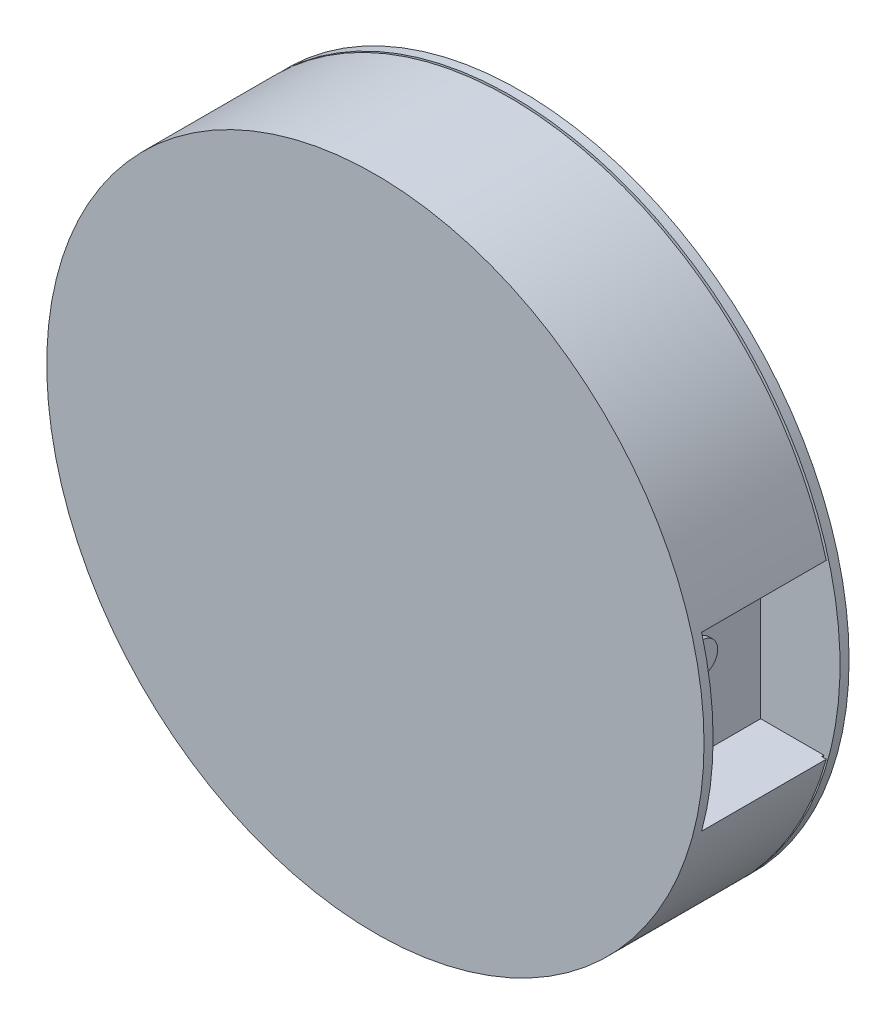
ISO-10303-21;
HEADER;
FILE_DESCRIPTION(('STEP AP214'),'2;1');
FILE_NAME('part.step','',(''),(''),'','','');
FILE_SCHEMA(('AUTOMOTIVE_DESIGN { 1 0 10303 214 1 1 1 1 }'));
ENDSEC;
DATA;
#1=APPLICATION_CONTEXT('core data for automotive mechanical design processes');
#2=APPLICATION_PROTOCOL_DEFINITION('international standard','automotive_design',2000,#1);
#3=PRODUCT_CONTEXT('',#1,'mechanical');
#4=PRODUCT('Part','Part','',(#3));
#5=PRODUCT_RELATED_PRODUCT_CATEGORY('part','',(#4));
#6=PRODUCT_DEFINITION_FORMATION('','',#4);
#7=PRODUCT_DEFINITION_CONTEXT('part definition',#1,'design');
#8=PRODUCT_DEFINITION('design','',#6,#7);
#9=PRODUCT_DEFINITION_SHAPE('','',#8);
#10=(LENGTH_UNIT() NAMED_UNIT(*) SI_UNIT(.MILLI.,.METRE.));
#11=(NAMED_UNIT(*) PLANE_ANGLE_UNIT() SI_UNIT($,.RADIAN.));
#12=(NAMED_UNIT(*) SI_UNIT($,.STERADIAN.) SOLID_ANGLE_UNIT());
#13=UNCERTAINTY_MEASURE_WITH_UNIT(LENGTH_MEASURE(1.E-05),#10,'distance_accuracy_value','');
#14=(GEOMETRIC_REPRESENTATION_CONTEXT(3) GLOBAL_UNCERTAINTY_ASSIGNED_CONTEXT((#13)) GLOBAL_UNIT_ASSIGNED_CONTEXT((#10,
#11,#12)) REPRESENTATION_CONTEXT('',''));
#15=CARTESIAN_POINT('',(0.,0.,0.));
#16=DIRECTION('',(0.,0.,1.));
#17=DIRECTION('',(1.,0.,0.));
#18=AXIS2_PLACEMENT_3D('',#15,#16,#17);
#19=CARTESIAN_POINT('',(0.,0.,32.));
#20=DIRECTION('',(0.,0.,-1.));
#21=DIRECTION('',(-1.,0.,0.));
#22=AXIS2_PLACEMENT_3D('',#19,#20,#21);
#23=CYLINDRICAL_SURFACE('',#22,72.4999999999998);
#24=CARTESIAN_POINT('',(0.,0.,0.));
#25=DIRECTION('',(0.,0.,1.));
#26=DIRECTION('',(1.,0.,0.));
#27=AXIS2_PLACEMENT_3D('',#24,#25,#26);
#28=CIRCLE('',#27,72.4999999999998);
#29=CARTESIAN_POINT('',(72.4999999999998,0.,0.));
#30=VERTEX_POINT('',#29);
#31=EDGE_CURVE('E166',#30,#30,#28,.T.);
#32=ORIENTED_EDGE('',*,*,#31,.T.);
#33=EDGE_LOOP('',(#32));
#34=FACE_BOUND('',#33,.T.);
#35=CARTESIAN_POINT('',(0.,0.,2.));
#36=DIRECTION('',(0.,0.,-1.));
#37=DIRECTION('',(-1.,0.,0.));
#38=AXIS2_PLACEMENT_3D('',#35,#36,#37);
#39=CIRCLE('',#38,72.4999999999998);
#40=CARTESIAN_POINT('',(-72.4999999999998,0.,2.));
#41=VERTEX_POINT('',#40);
#42=EDGE_CURVE('E163',#41,#41,#39,.T.);
#43=ORIENTED_EDGE('',*,*,#42,.T.);
#44=EDGE_LOOP('',(#43));
#45=FACE_BOUND('',#44,.T.);
#46=ADVANCED_FACE('F33',(#34,#45),#23,.T.);
#47=CARTESIAN_POINT('',(0.,0.,0.));
#48=DIRECTION('',(0.,0.,1.));
#49=DIRECTION('',(1.,0.,0.));
#50=AXIS2_PLACEMENT_3D('',#47,#48,#49);
#51=PLANE('',#50);
#52=ORIENTED_EDGE('',*,*,#31,.F.);
#53=EDGE_LOOP('',(#52));
#54=FACE_BOUND('',#53,.T.);
#55=ADVANCED_FACE('F207',(#54),#51,.F.);
#56=CARTESIAN_POINT('',(72.4999999999998,0.,2.));
#57=DIRECTION('',(0.,0.,1.));
#58=DIRECTION('',(1.,0.,0.));
#59=AXIS2_PLACEMENT_3D('',#56,#57,#58);
#60=PLANE('',#59);
#61=ORIENTED_EDGE('',*,*,#42,.F.);
#62=EDGE_LOOP('',(#61));
#63=FACE_BOUND('',#62,.T.);
#64=DIRECTION('',(1.,0.,0.));
#65=VECTOR('',#64,1.);
#66=CARTESIAN_POINT('',(54.9999999999998,-19.,2.));
#67=LINE('',#66,#65);
#68=CARTESIAN_POINT('',(54.9999999999998,-19.,2.));
#69=VERTEX_POINT('',#68);
#70=CARTESIAN_POINT('',(68.929311617047,-19.,2.));
#71=VERTEX_POINT('',#70);
#72=EDGE_CURVE('E107',#69,#71,#67,.T.);
#73=ORIENTED_EDGE('',*,*,#72,.T.);
#74=CARTESIAN_POINT('',(0.,0.,2.));
#75=DIRECTION('',(0.,0.,-1.));
#76=DIRECTION('',(-1.,0.,0.));
#77=AXIS2_PLACEMENT_3D('',#74,#75,#76);
#78=CIRCLE('',#77,71.4999999999998);
#79=CARTESIAN_POINT('',(68.929311617047,19.,2.));
#80=VERTEX_POINT('',#79);
#81=EDGE_CURVE('E160',#71,#80,#78,.T.);
#82=ORIENTED_EDGE('',*,*,#81,.T.);
#83=DIRECTION('',(1.,0.,0.));
#84=VECTOR('',#83,1.);
#85=CARTESIAN_POINT('',(54.9999999999998,19.,2.));
#86=LINE('',#85,#84);
#87=CARTESIAN_POINT('',(54.9999999999998,19.,2.));
#88=VERTEX_POINT('',#87);
#89=EDGE_CURVE('E143',#88,#80,#86,.T.);
#90=ORIENTED_EDGE('',*,*,#89,.F.);
#91=DIRECTION('',(0.,1.,0.));
#92=VECTOR('',#91,1.);
#93=CARTESIAN_POINT('',(54.9999999999998,-19.,2.));
#94=LINE('',#93,#92);
#95=EDGE_CURVE('E134',#69,#88,#94,.T.);
#96=ORIENTED_EDGE('',*,*,#95,.F.);
#97=EDGE_LOOP('',(#73,#82,#90,#96));
#98=FACE_BOUND('',#97,.T.);
#99=ADVANCED_FACE('F187',(#63,#98),#60,.T.);
#100=CARTESIAN_POINT('',(0.,0.,0.));
#101=DIRECTION('',(0.,0.,-1.));
#102=DIRECTION('',(-1.,0.,0.));
#103=AXIS2_PLACEMENT_3D('',#100,#101,#102);
#104=CYLINDRICAL_SURFACE('',#103,71.4999999999998);
#105=DIRECTION('',(0.,0.,-1.));
#106=VECTOR('',#105,1.);
#107=CARTESIAN_POINT('',(68.929311617047,-19.,0.));
#108=LINE('',#107,#106);
#109=CARTESIAN_POINT('',(68.929311617047,-19.,2.5));
#110=VERTEX_POINT('',#109);
#111=EDGE_CURVE('E152',#110,#71,#108,.T.);
#112=ORIENTED_EDGE('',*,*,#111,.F.);
#113=CARTESIAN_POINT('',(0.,0.,2.5));
#114=DIRECTION('',(0.,0.,-1.));
#115=DIRECTION('',(-1.,0.,0.));
#116=AXIS2_PLACEMENT_3D('',#113,#114,#115);
#117=CIRCLE('',#116,71.4999999999998);
#118=CARTESIAN_POINT('',(68.929311617047,19.,2.5));
#119=VERTEX_POINT('',#118);
#120=EDGE_CURVE('E157',#110,#119,#117,.T.);
#121=ORIENTED_EDGE('',*,*,#120,.T.);
#122=DIRECTION('',(0.,0.,-1.));
#123=VECTOR('',#122,1.);
#124=CARTESIAN_POINT('',(68.929311617047,19.,0.));
#125=LINE('',#124,#123);
#126=EDGE_CURVE('E149',#80,#119,#125,.F.);
#127=ORIENTED_EDGE('',*,*,#126,.F.);
#128=ORIENTED_EDGE('',*,*,#81,.F.);
#129=EDGE_LOOP('',(#112,#121,#127,#128));
#130=FACE_BOUND('',#129,.T.);
#131=ADVANCED_FACE('F182',(#130),#104,.T.);
#132=CARTESIAN_POINT('',(72.4999999999998,0.,2.5));
#133=DIRECTION('',(0.,0.,-1.));
#134=DIRECTION('',(-1.,0.,0.));
#135=AXIS2_PLACEMENT_3D('',#132,#133,#134);
#136=PLANE('',#135);
#137=DIRECTION('',(-1.,0.,0.));
#138=VECTOR('',#137,1.);
#139=CARTESIAN_POINT('',(72.4999999999998,-19.,2.5));
#140=LINE('',#139,#138);
#141=CARTESIAN_POINT('',(69.966063202098,-19.,2.5));
#142=VERTEX_POINT('',#141);
#143=EDGE_CURVE('E55',#142,#110,#140,.T.);
#144=ORIENTED_EDGE('',*,*,#143,.F.);
#145=CARTESIAN_POINT('',(0.,0.,2.5));
#146=DIRECTION('',(0.,0.,-1.));
#147=DIRECTION('',(-1.,0.,0.));
#148=AXIS2_PLACEMENT_3D('',#145,#146,#147);
#149=CIRCLE('',#148,72.4999999999998);
#150=CARTESIAN_POINT('',(69.966063202098,19.,2.5));
#151=VERTEX_POINT('',#150);
#152=EDGE_CURVE('E154',#142,#151,#149,.T.);
#153=ORIENTED_EDGE('',*,*,#152,.T.);
#154=DIRECTION('',(1.,0.,0.));
#155=VECTOR('',#154,1.);
#156=CARTESIAN_POINT('',(72.4999999999998,19.,2.5));
#157=LINE('',#156,#155);
#158=EDGE_CURVE('E47',#119,#151,#157,.T.);
#159=ORIENTED_EDGE('',*,*,#158,.F.);
#160=ORIENTED_EDGE('',*,*,#120,.F.);
#161=EDGE_LOOP('',(#144,#153,#159,#160));
#162=FACE_BOUND('',#161,.T.);
#163=ADVANCED_FACE('F178',(#162),#136,.T.);
#164=CARTESIAN_POINT('',(0.,0.,32.));
#165=DIRECTION('',(0.,0.,1.));
#166=DIRECTION('',(1.,0.,0.));
#167=AXIS2_PLACEMENT_3D('',#164,#165,#166);
#168=PLANE('',#167);
#169=CARTESIAN_POINT('',(0.,0.,32.));
#170=DIRECTION('',(0.,0.,1.));
#171=DIRECTION('',(1.,0.,0.));
#172=AXIS2_PLACEMENT_3D('',#169,#170,#171);
#173=CIRCLE('',#172,72.4999999999998);
#174=CARTESIAN_POINT('',(72.4999999999998,0.,32.));
#175=VERTEX_POINT('',#174);
#176=EDGE_CURVE('E167',#175,#175,#173,.T.);
#177=ORIENTED_EDGE('',*,*,#176,.T.);
#178=EDGE_LOOP('',(#177));
#179=FACE_BOUND('',#178,.T.);
#180=ADVANCED_FACE('F215',(#179),#168,.T.);
#181=ORIENTED_EDGE('',*,*,#176,.F.);
#182=EDGE_LOOP('',(#181));
#183=FACE_BOUND('',#182,.T.);
#184=CARTESIAN_POINT('',(0.,0.,30.));
#185=DIRECTION('',(0.,0.,1.));
#186=DIRECTION('',(1.,0.,0.));
#187=AXIS2_PLACEMENT_3D('',#184,#185,#186);
#188=CIRCLE('',#187,72.4999999999998);
#189=CARTESIAN_POINT('',(69.966063202098,-19.,30.));
#190=VERTEX_POINT('',#189);
#191=CARTESIAN_POINT('',(69.966063202098,19.,30.));
#192=VERTEX_POINT('',#191);
#193=EDGE_CURVE('E105',#190,#192,#188,.T.);
#194=ORIENTED_EDGE('',*,*,#193,.T.);
#195=DIRECTION('',(0.,0.,-1.));
#196=VECTOR('',#195,1.);
#197=CARTESIAN_POINT('',(69.966063202098,19.,32.));
#198=LINE('',#197,#196);
#199=EDGE_CURVE('E40',#192,#151,#198,.T.);
#200=ORIENTED_EDGE('',*,*,#199,.T.);
#201=ORIENTED_EDGE('',*,*,#152,.F.);
#202=DIRECTION('',(0.,0.,-1.));
#203=VECTOR('',#202,1.);
#204=CARTESIAN_POINT('',(69.966063202098,-19.,32.));
#205=LINE('',#204,#203);
#206=EDGE_CURVE('E173',#142,#190,#205,.F.);
#207=ORIENTED_EDGE('',*,*,#206,.T.);
#208=EDGE_LOOP('',(#194,#200,#201,#207));
#209=FACE_BOUND('',#208,.T.);
#210=ADVANCED_FACE('F176',(#183,#209),#23,.T.);
#211=CARTESIAN_POINT('',(54.9999999999998,-19.,30.));
#212=DIRECTION('',(0.,0.,1.));
#213=DIRECTION('',(1.,0.,0.));
#214=AXIS2_PLACEMENT_3D('',#211,#212,#213);
#215=PLANE('',#214);
#216=ORIENTED_EDGE('',*,*,#193,.F.);
#217=DIRECTION('',(1.,0.,0.));
#218=VECTOR('',#217,1.);
#219=CARTESIAN_POINT('',(54.9999999999998,-19.,30.));
#220=LINE('',#219,#218);
#221=CARTESIAN_POINT('',(53.9999999999998,-19.,30.));
#222=VERTEX_POINT('',#221);
#223=EDGE_CURVE('E98',#222,#190,#220,.T.);
#224=ORIENTED_EDGE('',*,*,#223,.F.);
#225=DIRECTION('',(0.,-1.,0.));
#226=VECTOR('',#225,1.);
#227=CARTESIAN_POINT('',(53.9999999999998,19.,30.));
#228=LINE('',#227,#226);
#229=CARTESIAN_POINT('',(53.9999999999998,19.,30.));
#230=VERTEX_POINT('',#229);
#231=EDGE_CURVE('E103',#230,#222,#228,.T.);
#232=ORIENTED_EDGE('',*,*,#231,.F.);
#233=DIRECTION('',(1.,0.,0.));
#234=VECTOR('',#233,1.);
#235=CARTESIAN_POINT('',(54.9999999999998,19.,30.));
#236=LINE('',#235,#234);
#237=EDGE_CURVE('E108',#230,#192,#236,.T.);
#238=ORIENTED_EDGE('',*,*,#237,.T.);
#239=EDGE_LOOP('',(#216,#224,#232,#238));
#240=FACE_BOUND('',#239,.T.);
#241=ADVANCED_FACE('F100',(#240),#215,.F.);
#242=CARTESIAN_POINT('',(54.9999999999998,-19.,30.));
#243=DIRECTION('',(0.,-1.,0.));
#244=DIRECTION('',(0.,0.,-1.));
#245=AXIS2_PLACEMENT_3D('',#242,#243,#244);
#246=PLANE('',#245);
#247=ORIENTED_EDGE('',*,*,#111,.T.);
#248=ORIENTED_EDGE('',*,*,#72,.F.);
#249=DIRECTION('',(0.,0.,-1.));
#250=VECTOR('',#249,1.);
#251=CARTESIAN_POINT('',(54.9999999999998,-19.,30.));
#252=LINE('',#251,#250);
#253=CARTESIAN_POINT('',(54.9999999999998,-19.,29.));
#254=VERTEX_POINT('',#253);
#255=EDGE_CURVE('E141',#254,#69,#252,.T.);
#256=ORIENTED_EDGE('',*,*,#255,.F.);
#257=DIRECTION('',(1.,0.,0.));
#258=VECTOR('',#257,1.);
#259=CARTESIAN_POINT('',(53.9999999999998,-19.,29.));
#260=LINE('',#259,#258);
#261=CARTESIAN_POINT('',(53.9999999999998,-19.,29.));
#262=VERTEX_POINT('',#261);
#263=EDGE_CURVE('E114',#262,#254,#260,.T.);
#264=ORIENTED_EDGE('',*,*,#263,.F.);
#265=DIRECTION('',(0.,0.,-1.));
#266=VECTOR('',#265,1.);
#267=CARTESIAN_POINT('',(53.9999999999998,-19.,30.));
#268=LINE('',#267,#266);
#269=EDGE_CURVE('E111',#222,#262,#268,.T.);
#270=ORIENTED_EDGE('',*,*,#269,.F.);
#271=ORIENTED_EDGE('',*,*,#223,.T.);
#272=ORIENTED_EDGE('',*,*,#206,.F.);
#273=ORIENTED_EDGE('',*,*,#143,.T.);
#274=EDGE_LOOP('',(#247,#248,#256,#264,#270,#271,#272,#273));
#275=FACE_BOUND('',#274,.T.);
#276=ADVANCED_FACE('F112',(#275),#246,.F.);
#277=CARTESIAN_POINT('',(54.9999999999998,19.,30.));
#278=DIRECTION('',(0.,1.,0.));
#279=DIRECTION('',(0.,0.,1.));
#280=AXIS2_PLACEMENT_3D('',#277,#278,#279);
#281=PLANE('',#280);
#282=ORIENTED_EDGE('',*,*,#126,.T.);
#283=ORIENTED_EDGE('',*,*,#158,.T.);
#284=ORIENTED_EDGE('',*,*,#199,.F.);
#285=ORIENTED_EDGE('',*,*,#237,.F.);
#286=DIRECTION('',(0.,0.,1.));
#287=VECTOR('',#286,1.);
#288=CARTESIAN_POINT('',(53.9999999999998,19.,30.));
#289=LINE('',#288,#287);
#290=CARTESIAN_POINT('',(53.9999999999998,19.,29.));
#291=VERTEX_POINT('',#290);
#292=EDGE_CURVE('E122',#291,#230,#289,.T.);
#293=ORIENTED_EDGE('',*,*,#292,.F.);
#294=DIRECTION('',(1.,0.,0.));
#295=VECTOR('',#294,1.);
#296=CARTESIAN_POINT('',(53.9999999999998,19.,29.));
#297=LINE('',#296,#295);
#298=CARTESIAN_POINT('',(54.9999999999998,19.,29.));
#299=VERTEX_POINT('',#298);
#300=EDGE_CURVE('E132',#291,#299,#297,.T.);
#301=ORIENTED_EDGE('',*,*,#300,.T.);
#302=DIRECTION('',(0.,0.,1.));
#303=VECTOR('',#302,1.);
#304=CARTESIAN_POINT('',(54.9999999999998,19.,30.));
#305=LINE('',#304,#303);
#306=EDGE_CURVE('E138',#88,#299,#305,.T.);
#307=ORIENTED_EDGE('',*,*,#306,.F.);
#308=ORIENTED_EDGE('',*,*,#89,.T.);
#309=EDGE_LOOP('',(#282,#283,#284,#285,#293,#301,#307,#308));
#310=FACE_BOUND('',#309,.T.);
#311=ADVANCED_FACE('F194',(#310),#281,.F.);
#312=CARTESIAN_POINT('',(54.9999999999998,0.,0.));
#313=DIRECTION('',(-1.,0.,0.));
#314=DIRECTION('',(0.,0.,1.));
#315=AXIS2_PLACEMENT_3D('',#312,#313,#314);
#316=PLANE('',#315);
#317=CARTESIAN_POINT('',(54.9999999999998,0.,16.));
#318=DIRECTION('',(-1.,0.,0.));
#319=DIRECTION('',(0.,0.,1.));
#320=AXIS2_PLACEMENT_3D('',#317,#318,#319);
#321=CIRCLE('',#320,3.5);
#322=CARTESIAN_POINT('',(54.9999999999998,0.,19.5));
#323=VERTEX_POINT('',#322);
#324=EDGE_CURVE('E11',#323,#323,#321,.F.);
#325=ORIENTED_EDGE('',*,*,#324,.F.);
#326=EDGE_LOOP('',(#325));
#327=FACE_BOUND('',#326,.T.);
#328=ORIENTED_EDGE('',*,*,#306,.T.);
#329=DIRECTION('',(0.,1.,0.));
#330=VECTOR('',#329,1.);
#331=CARTESIAN_POINT('',(54.9999999999998,19.,29.));
#332=LINE('',#331,#330);
#333=EDGE_CURVE('E123',#254,#299,#332,.T.);
#334=ORIENTED_EDGE('',*,*,#333,.F.);
#335=ORIENTED_EDGE('',*,*,#255,.T.);
#336=ORIENTED_EDGE('',*,*,#95,.T.);
#337=EDGE_LOOP('',(#328,#334,#335,#336));
#338=FACE_BOUND('',#337,.T.);
#339=ADVANCED_FACE('F190',(#327,#338),#316,.F.);
#340=CARTESIAN_POINT('',(53.9999999999998,19.,29.));
#341=DIRECTION('',(0.,0.,-1.));
#342=DIRECTION('',(0.,1.,0.));
#343=AXIS2_PLACEMENT_3D('',#340,#341,#342);
#344=PLANE('',#343);
#345=ORIENTED_EDGE('',*,*,#333,.T.);
#346=ORIENTED_EDGE('',*,*,#300,.F.);
#347=DIRECTION('',(0.,1.,0.));
#348=VECTOR('',#347,1.);
#349=CARTESIAN_POINT('',(53.9999999999998,19.,29.));
#350=LINE('',#349,#348);
#351=EDGE_CURVE('E118',#262,#291,#350,.T.);
#352=ORIENTED_EDGE('',*,*,#351,.F.);
#353=ORIENTED_EDGE('',*,*,#263,.T.);
#354=EDGE_LOOP('',(#345,#346,#352,#353));
#355=FACE_BOUND('',#354,.T.);
#356=ADVANCED_FACE('F193',(#355),#344,.F.);
#357=CARTESIAN_POINT('',(53.9999999999998,0.,0.));
#358=DIRECTION('',(1.,0.,0.));
#359=DIRECTION('',(0.,0.,-1.));
#360=AXIS2_PLACEMENT_3D('',#357,#358,#359);
#361=PLANE('',#360);
#362=ORIENTED_EDGE('',*,*,#231,.T.);
#363=ORIENTED_EDGE('',*,*,#269,.T.);
#364=ORIENTED_EDGE('',*,*,#351,.T.);
#365=ORIENTED_EDGE('',*,*,#292,.T.);
#366=EDGE_LOOP('',(#362,#363,#364,#365));
#367=FACE_BOUND('',#366,.T.);
#368=ADVANCED_FACE('F120',(#367),#361,.T.);
#369=CARTESIAN_POINT('',(55.9999999999998,0.,16.));
#370=DIRECTION('',(-1.,0.,0.));
#371=DIRECTION('',(0.,0.,1.));
#372=AXIS2_PLACEMENT_3D('',#369,#370,#371);
#373=CYLINDRICAL_SURFACE('',#372,3.5);
#374=CARTESIAN_POINT('',(55.9999999999998,0.,16.));
#375=DIRECTION('',(1.,0.,0.));
#376=DIRECTION('',(0.,0.,-1.));
#377=AXIS2_PLACEMENT_3D('',#374,#375,#376);
#378=CIRCLE('',#377,3.5);
#379=CARTESIAN_POINT('',(55.9999999999998,0.,12.5));
#380=VERTEX_POINT('',#379);
#381=EDGE_CURVE('E126',#380,#380,#378,.T.);
#382=ORIENTED_EDGE('',*,*,#381,.F.);
#383=EDGE_LOOP('',(#382));
#384=FACE_BOUND('',#383,.T.);
#385=ORIENTED_EDGE('',*,*,#324,.T.);
#386=EDGE_LOOP('',(#385));
#387=FACE_BOUND('',#386,.T.);
#388=ADVANCED_FACE('F284',(#384,#387),#373,.T.);
#389=CARTESIAN_POINT('',(55.9999999999998,0.,16.));
#390=DIRECTION('',(1.,0.,0.));
#391=DIRECTION('',(0.,0.,-1.));
#392=AXIS2_PLACEMENT_3D('',#389,#390,#391);
#393=PLANE('',#392);
#394=ORIENTED_EDGE('',*,*,#381,.T.);
#395=EDGE_LOOP('',(#394));
#396=FACE_BOUND('',#395,.T.);
#397=ADVANCED_FACE('F298',(#396),#393,.T.);
#398=CLOSED_SHELL('',(#46,#55,#99,#131,#163,#180,#210,#241,#276,#311,#339,#356,#368,#388,#397));
#399=MANIFOLD_SOLID_BREP('B2',#398);
#400=ADVANCED_BREP_SHAPE_REPRESENTATION('',(#18,#399),#14);
#401=SHAPE_DEFINITION_REPRESENTATION(#9,#400);
ENDSEC;
END-ISO-10303-21;
